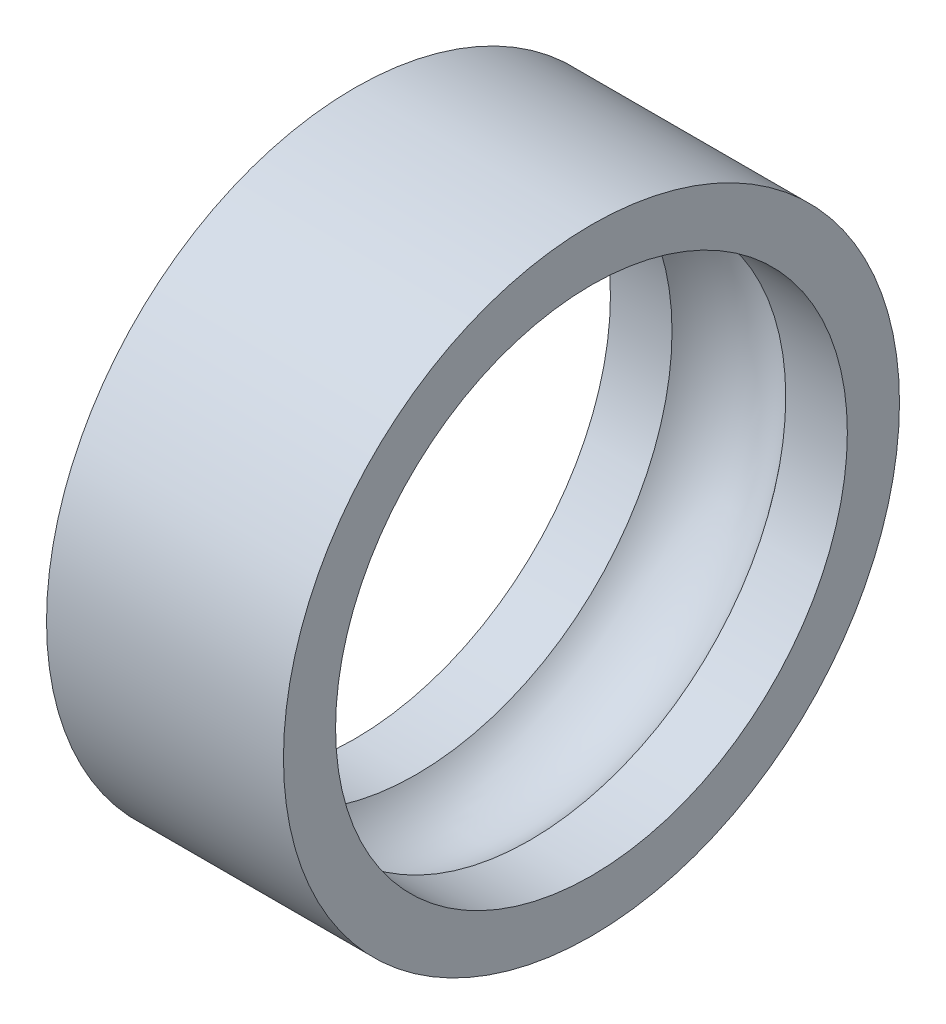
ISO-10303-21;
HEADER;
FILE_DESCRIPTION(('STEP AP214'),'2;1');
FILE_NAME('part.step','',(''),(''),'','','');
FILE_SCHEMA(('AUTOMOTIVE_DESIGN { 1 0 10303 214 1 1 1 1 }'));
ENDSEC;
DATA;
#1=APPLICATION_CONTEXT('core data for automotive mechanical design processes');
#2=APPLICATION_PROTOCOL_DEFINITION('international standard','automotive_design',2000,#1);
#3=PRODUCT_CONTEXT('',#1,'mechanical');
#4=PRODUCT('Part','Part','',(#3));
#5=PRODUCT_RELATED_PRODUCT_CATEGORY('part','',(#4));
#6=PRODUCT_DEFINITION_FORMATION('','',#4);
#7=PRODUCT_DEFINITION_CONTEXT('part definition',#1,'design');
#8=PRODUCT_DEFINITION('design','',#6,#7);
#9=PRODUCT_DEFINITION_SHAPE('','',#8);
#10=(LENGTH_UNIT() NAMED_UNIT(*) SI_UNIT(.MILLI.,.METRE.));
#11=(NAMED_UNIT(*) PLANE_ANGLE_UNIT() SI_UNIT($,.RADIAN.));
#12=(NAMED_UNIT(*) SI_UNIT($,.STERADIAN.) SOLID_ANGLE_UNIT());
#13=UNCERTAINTY_MEASURE_WITH_UNIT(LENGTH_MEASURE(1.E-05),#10,'distance_accuracy_value','');
#14=(GEOMETRIC_REPRESENTATION_CONTEXT(3) GLOBAL_UNCERTAINTY_ASSIGNED_CONTEXT((#13)) GLOBAL_UNIT_ASSIGNED_CONTEXT((#10,
#11,#12)) REPRESENTATION_CONTEXT('',''));
#15=CARTESIAN_POINT('',(0.,0.,0.));
#16=DIRECTION('',(0.,0.,1.));
#17=DIRECTION('',(1.,0.,0.));
#18=AXIS2_PLACEMENT_3D('',#15,#16,#17);
#19=CARTESIAN_POINT('',(2.5,6.5,0.));
#20=DIRECTION('',(1.,0.,0.));
#21=DIRECTION('',(0.,0.,-1.));
#22=AXIS2_PLACEMENT_3D('',#19,#20,#21);
#23=PLANE('',#22);
#24=CARTESIAN_POINT('',(2.5,0.,0.));
#25=DIRECTION('',(1.,0.,0.));
#26=DIRECTION('',(0.,0.,-1.));
#27=AXIS2_PLACEMENT_3D('',#24,#25,#26);
#28=CIRCLE('',#27,6.5);
#29=CARTESIAN_POINT('',(2.5,0.,-6.5));
#30=VERTEX_POINT('',#29);
#31=EDGE_CURVE('E10',#30,#30,#28,.T.);
#32=ORIENTED_EDGE('',*,*,#31,.T.);
#33=EDGE_LOOP('',(#32));
#34=FACE_BOUND('',#33,.T.);
#35=CARTESIAN_POINT('',(2.5,0.,0.));
#36=DIRECTION('',(1.,0.,0.));
#37=DIRECTION('',(0.,0.,-1.));
#38=AXIS2_PLACEMENT_3D('',#35,#36,#37);
#39=CIRCLE('',#38,5.4);
#40=CARTESIAN_POINT('',(2.5,0.,-5.4));
#41=VERTEX_POINT('',#40);
#42=EDGE_CURVE('E52',#41,#41,#39,.T.);
#43=ORIENTED_EDGE('',*,*,#42,.F.);
#44=EDGE_LOOP('',(#43));
#45=FACE_BOUND('',#44,.T.);
#46=ADVANCED_FACE('F30',(#34,#45),#23,.T.);
#47=CARTESIAN_POINT('',(0.,0.,0.));
#48=DIRECTION('',(1.,0.,0.));
#49=DIRECTION('',(0.,0.,-1.));
#50=AXIS2_PLACEMENT_3D('',#47,#48,#49);
#51=CYLINDRICAL_SURFACE('',#50,6.5);
#52=CARTESIAN_POINT('',(-2.5,0.,0.));
#53=DIRECTION('',(1.,0.,0.));
#54=DIRECTION('',(0.,0.,-1.));
#55=AXIS2_PLACEMENT_3D('',#52,#53,#54);
#56=CIRCLE('',#55,6.5);
#57=CARTESIAN_POINT('',(-2.5,0.,-6.5));
#58=VERTEX_POINT('',#57);
#59=EDGE_CURVE('E36',#58,#58,#56,.T.);
#60=ORIENTED_EDGE('',*,*,#59,.T.);
#61=EDGE_LOOP('',(#60));
#62=FACE_BOUND('',#61,.T.);
#63=ORIENTED_EDGE('',*,*,#31,.F.);
#64=EDGE_LOOP('',(#63));
#65=FACE_BOUND('',#64,.T.);
#66=ADVANCED_FACE('F60',(#62,#65),#51,.T.);
#67=CARTESIAN_POINT('',(-2.5,5.4,0.));
#68=DIRECTION('',(-1.,0.,0.));
#69=DIRECTION('',(0.,0.,1.));
#70=AXIS2_PLACEMENT_3D('',#67,#68,#69);
#71=PLANE('',#70);
#72=CARTESIAN_POINT('',(-2.5,0.,0.));
#73=DIRECTION('',(1.,0.,0.));
#74=DIRECTION('',(0.,0.,-1.));
#75=AXIS2_PLACEMENT_3D('',#72,#73,#74);
#76=CIRCLE('',#75,5.4);
#77=CARTESIAN_POINT('',(-2.5,0.,-5.4));
#78=VERTEX_POINT('',#77);
#79=EDGE_CURVE('E40',#78,#78,#76,.T.);
#80=ORIENTED_EDGE('',*,*,#79,.T.);
#81=EDGE_LOOP('',(#80));
#82=FACE_BOUND('',#81,.T.);
#83=ORIENTED_EDGE('',*,*,#59,.F.);
#84=EDGE_LOOP('',(#83));
#85=FACE_BOUND('',#84,.T.);
#86=ADVANCED_FACE('F64',(#82,#85),#71,.T.);
#87=CARTESIAN_POINT('',(0.,0.,0.));
#88=DIRECTION('',(1.,0.,0.));
#89=DIRECTION('',(0.,0.,-1.));
#90=AXIS2_PLACEMENT_3D('',#87,#88,#89);
#91=CYLINDRICAL_SURFACE('',#90,5.4);
#92=CARTESIAN_POINT('',(-1.2,0.,0.));
#93=DIRECTION('',(1.,0.,0.));
#94=DIRECTION('',(0.,0.,-1.));
#95=AXIS2_PLACEMENT_3D('',#92,#93,#94);
#96=CIRCLE('',#95,5.4);
#97=CARTESIAN_POINT('',(-1.2,0.,-5.4));
#98=VERTEX_POINT('',#97);
#99=EDGE_CURVE('E44',#98,#98,#96,.T.);
#100=ORIENTED_EDGE('',*,*,#99,.T.);
#101=EDGE_LOOP('',(#100));
#102=FACE_BOUND('',#101,.T.);
#103=ORIENTED_EDGE('',*,*,#79,.F.);
#104=EDGE_LOOP('',(#103));
#105=FACE_BOUND('',#104,.T.);
#106=ADVANCED_FACE('F68',(#102,#105),#91,.F.);
#107=CARTESIAN_POINT('',(0.,0.,0.));
#108=DIRECTION('',(1.,0.,0.));
#109=DIRECTION('',(0.,0.,-1.));
#110=AXIS2_PLACEMENT_3D('',#107,#108,#109);
#111=TOROIDAL_SURFACE('',#110,4.5,1.5);
#112=CARTESIAN_POINT('',(1.2,0.,0.));
#113=DIRECTION('',(1.,0.,0.));
#114=DIRECTION('',(0.,0.,-1.));
#115=AXIS2_PLACEMENT_3D('',#112,#113,#114);
#116=CIRCLE('',#115,5.4);
#117=CARTESIAN_POINT('',(1.2,0.,-5.4));
#118=VERTEX_POINT('',#117);
#119=EDGE_CURVE('E49',#118,#118,#116,.T.);
#120=ORIENTED_EDGE('',*,*,#119,.T.);
#121=EDGE_LOOP('',(#120));
#122=FACE_BOUND('',#121,.T.);
#123=ORIENTED_EDGE('',*,*,#99,.F.);
#124=EDGE_LOOP('',(#123));
#125=FACE_BOUND('',#124,.T.);
#126=ADVANCED_FACE('F75',(#122,#125),#111,.F.);
#127=CARTESIAN_POINT('',(0.,0.,0.));
#128=DIRECTION('',(1.,0.,0.));
#129=DIRECTION('',(0.,0.,-1.));
#130=AXIS2_PLACEMENT_3D('',#127,#128,#129);
#131=CYLINDRICAL_SURFACE('',#130,5.4);
#132=ORIENTED_EDGE('',*,*,#42,.T.);
#133=EDGE_LOOP('',(#132));
#134=FACE_BOUND('',#133,.T.);
#135=ORIENTED_EDGE('',*,*,#119,.F.);
#136=EDGE_LOOP('',(#135));
#137=FACE_BOUND('',#136,.T.);
#138=ADVANCED_FACE('F56',(#134,#137),#131,.F.);
#139=CLOSED_SHELL('',(#46,#66,#86,#106,#126,#138));
#140=MANIFOLD_SOLID_BREP('B2',#139);
#141=ADVANCED_BREP_SHAPE_REPRESENTATION('',(#18,#140),#14);
#142=SHAPE_DEFINITION_REPRESENTATION(#9,#141);
ENDSEC;
END-ISO-10303-21;
